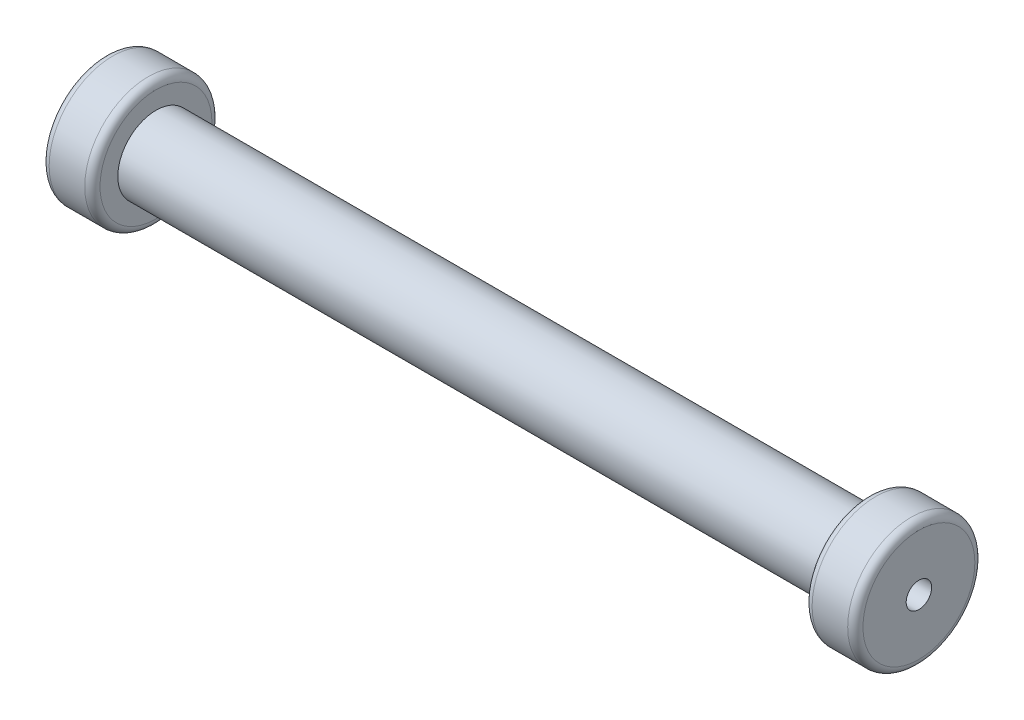
ISO-10303-21;
HEADER;
FILE_DESCRIPTION(('STEP AP214'),'2;1');
FILE_NAME('part.step','',(''),(''),'','','');
FILE_SCHEMA(('AUTOMOTIVE_DESIGN { 1 0 10303 214 1 1 1 1 }'));
ENDSEC;
DATA;
#1=APPLICATION_CONTEXT('core data for automotive mechanical design processes');
#2=APPLICATION_PROTOCOL_DEFINITION('international standard','automotive_design',2000,#1);
#3=PRODUCT_CONTEXT('',#1,'mechanical');
#4=PRODUCT('Part','Part','',(#3));
#5=PRODUCT_RELATED_PRODUCT_CATEGORY('part','',(#4));
#6=PRODUCT_DEFINITION_FORMATION('','',#4);
#7=PRODUCT_DEFINITION_CONTEXT('part definition',#1,'design');
#8=PRODUCT_DEFINITION('design','',#6,#7);
#9=PRODUCT_DEFINITION_SHAPE('','',#8);
#10=(LENGTH_UNIT() NAMED_UNIT(*) SI_UNIT(.MILLI.,.METRE.));
#11=(NAMED_UNIT(*) PLANE_ANGLE_UNIT() SI_UNIT($,.RADIAN.));
#12=(NAMED_UNIT(*) SI_UNIT($,.STERADIAN.) SOLID_ANGLE_UNIT());
#13=UNCERTAINTY_MEASURE_WITH_UNIT(LENGTH_MEASURE(1.E-05),#10,'distance_accuracy_value','');
#14=(GEOMETRIC_REPRESENTATION_CONTEXT(3) GLOBAL_UNCERTAINTY_ASSIGNED_CONTEXT((#13)) GLOBAL_UNIT_ASSIGNED_CONTEXT((#10,
#11,#12)) REPRESENTATION_CONTEXT('',''));
#15=CARTESIAN_POINT('',(0.,0.,0.));
#16=DIRECTION('',(0.,0.,1.));
#17=DIRECTION('',(1.,0.,0.));
#18=AXIS2_PLACEMENT_3D('',#15,#16,#17);
#19=CARTESIAN_POINT('',(-179.61578341398,0.,0.));
#20=DIRECTION('',(-1.,0.,0.));
#21=DIRECTION('',(0.,0.,1.));
#22=AXIS2_PLACEMENT_3D('',#19,#20,#21);
#23=CYLINDRICAL_SURFACE('',#22,24.9999999999999);
#24=CARTESIAN_POINT('',(143.,0.,0.));
#25=DIRECTION('',(-1.,0.,0.));
#26=DIRECTION('',(0.,0.,1.));
#27=AXIS2_PLACEMENT_3D('',#24,#25,#26);
#28=CIRCLE('',#27,24.9999999999999);
#29=CARTESIAN_POINT('',(143.,0.,24.9999999999999));
#30=VERTEX_POINT('',#29);
#31=EDGE_CURVE('E73',#30,#30,#28,.F.);
#32=ORIENTED_EDGE('',*,*,#31,.T.);
#33=EDGE_LOOP('',(#32));
#34=FACE_BOUND('',#33,.T.);
#35=CARTESIAN_POINT('',(157.,0.,0.));
#36=DIRECTION('',(1.,0.,0.));
#37=DIRECTION('',(0.,0.,-1.));
#38=AXIS2_PLACEMENT_3D('',#35,#36,#37);
#39=CIRCLE('',#38,24.9999999999999);
#40=CARTESIAN_POINT('',(157.,0.,-24.9999999999999));
#41=VERTEX_POINT('',#40);
#42=EDGE_CURVE('E77',#41,#41,#39,.F.);
#43=ORIENTED_EDGE('',*,*,#42,.T.);
#44=EDGE_LOOP('',(#43));
#45=FACE_BOUND('',#44,.T.);
#46=ADVANCED_FACE('F45',(#34,#45),#23,.T.);
#47=CARTESIAN_POINT('',(140.,0.,24.9999999999999));
#48=DIRECTION('',(-1.,0.,0.));
#49=DIRECTION('',(0.,0.,1.));
#50=AXIS2_PLACEMENT_3D('',#47,#48,#49);
#51=PLANE('',#50);
#52=CARTESIAN_POINT('',(140.,0.,0.));
#53=DIRECTION('',(-1.,0.,0.));
#54=DIRECTION('',(0.,0.,1.));
#55=AXIS2_PLACEMENT_3D('',#52,#53,#54);
#56=CIRCLE('',#55,21.9999999999999);
#57=CARTESIAN_POINT('',(140.,0.,21.9999999999999));
#58=VERTEX_POINT('',#57);
#59=EDGE_CURVE('E81',#58,#58,#56,.T.);
#60=ORIENTED_EDGE('',*,*,#59,.T.);
#61=EDGE_LOOP('',(#60));
#62=FACE_BOUND('',#61,.T.);
#63=CARTESIAN_POINT('',(140.,0.,0.));
#64=DIRECTION('',(-1.,0.,0.));
#65=DIRECTION('',(0.,0.,1.));
#66=AXIS2_PLACEMENT_3D('',#63,#64,#65);
#67=CIRCLE('',#66,15.);
#68=CARTESIAN_POINT('',(140.,0.,15.));
#69=VERTEX_POINT('',#68);
#70=EDGE_CURVE('E85',#69,#69,#67,.T.);
#71=ORIENTED_EDGE('',*,*,#70,.F.);
#72=EDGE_LOOP('',(#71));
#73=FACE_BOUND('',#72,.T.);
#74=ADVANCED_FACE('F126',(#62,#73),#51,.T.);
#75=CARTESIAN_POINT('',(-179.61578341398,0.,0.));
#76=DIRECTION('',(-1.,0.,0.));
#77=DIRECTION('',(0.,0.,1.));
#78=AXIS2_PLACEMENT_3D('',#75,#76,#77);
#79=CYLINDRICAL_SURFACE('',#78,15.);
#80=ORIENTED_EDGE('',*,*,#70,.T.);
#81=EDGE_LOOP('',(#80));
#82=FACE_BOUND('',#81,.T.);
#83=CARTESIAN_POINT('',(-140.,0.,0.));
#84=DIRECTION('',(-1.,0.,0.));
#85=DIRECTION('',(0.,0.,1.));
#86=AXIS2_PLACEMENT_3D('',#83,#84,#85);
#87=CIRCLE('',#86,15.);
#88=CARTESIAN_POINT('',(-140.,0.,15.));
#89=VERTEX_POINT('',#88);
#90=EDGE_CURVE('E89',#89,#89,#87,.T.);
#91=ORIENTED_EDGE('',*,*,#90,.F.);
#92=EDGE_LOOP('',(#91));
#93=FACE_BOUND('',#92,.T.);
#94=ADVANCED_FACE('F133',(#82,#93),#79,.T.);
#95=CARTESIAN_POINT('',(-140.,0.,24.9999999999999));
#96=DIRECTION('',(1.,0.,0.));
#97=DIRECTION('',(0.,0.,-1.));
#98=AXIS2_PLACEMENT_3D('',#95,#96,#97);
#99=PLANE('',#98);
#100=CARTESIAN_POINT('',(-140.,0.,0.));
#101=DIRECTION('',(1.,0.,0.));
#102=DIRECTION('',(0.,0.,-1.));
#103=AXIS2_PLACEMENT_3D('',#100,#101,#102);
#104=CIRCLE('',#103,21.9999999999999);
#105=CARTESIAN_POINT('',(-140.,0.,-21.9999999999999));
#106=VERTEX_POINT('',#105);
#107=EDGE_CURVE('E10',#106,#106,#104,.T.);
#108=ORIENTED_EDGE('',*,*,#107,.T.);
#109=EDGE_LOOP('',(#108));
#110=FACE_BOUND('',#109,.T.);
#111=ORIENTED_EDGE('',*,*,#90,.T.);
#112=EDGE_LOOP('',(#111));
#113=FACE_BOUND('',#112,.T.);
#114=ADVANCED_FACE('F154',(#110,#113),#99,.T.);
#115=CARTESIAN_POINT('',(-179.61578341398,0.,0.));
#116=DIRECTION('',(-1.,0.,0.));
#117=DIRECTION('',(0.,0.,1.));
#118=AXIS2_PLACEMENT_3D('',#115,#116,#117);
#119=CYLINDRICAL_SURFACE('',#118,24.9999999999999);
#120=CARTESIAN_POINT('',(-157.,0.,0.));
#121=DIRECTION('',(-1.,0.,0.));
#122=DIRECTION('',(0.,0.,1.));
#123=AXIS2_PLACEMENT_3D('',#120,#121,#122);
#124=CIRCLE('',#123,24.9999999999999);
#125=CARTESIAN_POINT('',(-157.,0.,24.9999999999999));
#126=VERTEX_POINT('',#125);
#127=EDGE_CURVE('E53',#126,#126,#124,.F.);
#128=ORIENTED_EDGE('',*,*,#127,.T.);
#129=EDGE_LOOP('',(#128));
#130=FACE_BOUND('',#129,.T.);
#131=CARTESIAN_POINT('',(-143.,0.,0.));
#132=DIRECTION('',(1.,0.,0.));
#133=DIRECTION('',(0.,0.,-1.));
#134=AXIS2_PLACEMENT_3D('',#131,#132,#133);
#135=CIRCLE('',#134,24.9999999999999);
#136=CARTESIAN_POINT('',(-143.,0.,-24.9999999999999));
#137=VERTEX_POINT('',#136);
#138=EDGE_CURVE('E58',#137,#137,#135,.F.);
#139=ORIENTED_EDGE('',*,*,#138,.T.);
#140=EDGE_LOOP('',(#139));
#141=FACE_BOUND('',#140,.T.);
#142=ADVANCED_FACE('F149',(#130,#141),#119,.T.);
#143=CARTESIAN_POINT('',(-160.,0.,0.));
#144=DIRECTION('',(-1.,0.,0.));
#145=DIRECTION('',(0.,0.,1.));
#146=AXIS2_PLACEMENT_3D('',#143,#144,#145);
#147=PLANE('',#146);
#148=CARTESIAN_POINT('',(-160.,0.,0.));
#149=DIRECTION('',(1.,0.,0.));
#150=DIRECTION('',(0.,0.,-1.));
#151=AXIS2_PLACEMENT_3D('',#148,#149,#150);
#152=CIRCLE('',#151,5.);
#153=CARTESIAN_POINT('',(-160.,0.,-5.));
#154=VERTEX_POINT('',#153);
#155=EDGE_CURVE('E93',#154,#154,#152,.T.);
#156=ORIENTED_EDGE('',*,*,#155,.T.);
#157=EDGE_LOOP('',(#156));
#158=FACE_BOUND('',#157,.T.);
#159=CARTESIAN_POINT('',(-160.,0.,0.));
#160=DIRECTION('',(-1.,0.,0.));
#161=DIRECTION('',(0.,0.,1.));
#162=AXIS2_PLACEMENT_3D('',#159,#160,#161);
#163=CIRCLE('',#162,21.9999999999999);
#164=CARTESIAN_POINT('',(-160.,0.,21.9999999999999));
#165=VERTEX_POINT('',#164);
#166=EDGE_CURVE('E63',#165,#165,#163,.T.);
#167=ORIENTED_EDGE('',*,*,#166,.T.);
#168=EDGE_LOOP('',(#167));
#169=FACE_BOUND('',#168,.T.);
#170=ADVANCED_FACE('F102',(#158,#169),#147,.T.);
#171=CARTESIAN_POINT('',(160.,0.,0.));
#172=DIRECTION('',(1.,0.,0.));
#173=DIRECTION('',(0.,0.,-1.));
#174=AXIS2_PLACEMENT_3D('',#171,#172,#173);
#175=PLANE('',#174);
#176=CARTESIAN_POINT('',(160.,0.,0.));
#177=DIRECTION('',(1.,0.,0.));
#178=DIRECTION('',(0.,0.,-1.));
#179=AXIS2_PLACEMENT_3D('',#176,#177,#178);
#180=CIRCLE('',#179,5.);
#181=CARTESIAN_POINT('',(160.,0.,-5.));
#182=VERTEX_POINT('',#181);
#183=EDGE_CURVE('E94',#182,#182,#180,.T.);
#184=ORIENTED_EDGE('',*,*,#183,.F.);
#185=EDGE_LOOP('',(#184));
#186=FACE_BOUND('',#185,.T.);
#187=CARTESIAN_POINT('',(160.,0.,0.));
#188=DIRECTION('',(1.,0.,0.));
#189=DIRECTION('',(0.,0.,-1.));
#190=AXIS2_PLACEMENT_3D('',#187,#188,#189);
#191=CIRCLE('',#190,21.9999999999999);
#192=CARTESIAN_POINT('',(160.,0.,-21.9999999999999));
#193=VERTEX_POINT('',#192);
#194=EDGE_CURVE('E69',#193,#193,#191,.T.);
#195=ORIENTED_EDGE('',*,*,#194,.T.);
#196=EDGE_LOOP('',(#195));
#197=FACE_BOUND('',#196,.T.);
#198=ADVANCED_FACE('F111',(#186,#197),#175,.T.);
#199=CARTESIAN_POINT('',(143.,0.,0.));
#200=DIRECTION('',(-1.,0.,0.));
#201=DIRECTION('',(0.,0.,1.));
#202=AXIS2_PLACEMENT_3D('',#199,#200,#201);
#203=TOROIDAL_SURFACE('',#202,21.9999999999999,3.);
#204=ORIENTED_EDGE('',*,*,#31,.F.);
#205=EDGE_LOOP('',(#204));
#206=FACE_BOUND('',#205,.T.);
#207=ORIENTED_EDGE('',*,*,#59,.F.);
#208=EDGE_LOOP('',(#207));
#209=FACE_BOUND('',#208,.T.);
#210=ADVANCED_FACE('F114',(#206,#209),#203,.T.);
#211=CARTESIAN_POINT('',(157.,0.,0.));
#212=DIRECTION('',(1.,0.,0.));
#213=DIRECTION('',(0.,0.,-1.));
#214=AXIS2_PLACEMENT_3D('',#211,#212,#213);
#215=TOROIDAL_SURFACE('',#214,21.9999999999999,3.);
#216=ORIENTED_EDGE('',*,*,#194,.F.);
#217=EDGE_LOOP('',(#216));
#218=FACE_BOUND('',#217,.T.);
#219=ORIENTED_EDGE('',*,*,#42,.F.);
#220=EDGE_LOOP('',(#219));
#221=FACE_BOUND('',#220,.T.);
#222=ADVANCED_FACE('F118',(#218,#221),#215,.T.);
#223=CARTESIAN_POINT('',(-157.,0.,0.));
#224=DIRECTION('',(-1.,0.,0.));
#225=DIRECTION('',(0.,0.,1.));
#226=AXIS2_PLACEMENT_3D('',#223,#224,#225);
#227=TOROIDAL_SURFACE('',#226,21.9999999999999,3.);
#228=ORIENTED_EDGE('',*,*,#127,.F.);
#229=EDGE_LOOP('',(#228));
#230=FACE_BOUND('',#229,.T.);
#231=ORIENTED_EDGE('',*,*,#166,.F.);
#232=EDGE_LOOP('',(#231));
#233=FACE_BOUND('',#232,.T.);
#234=ADVANCED_FACE('F121',(#230,#233),#227,.T.);
#235=CARTESIAN_POINT('',(-143.,0.,0.));
#236=DIRECTION('',(1.,0.,0.));
#237=DIRECTION('',(0.,0.,-1.));
#238=AXIS2_PLACEMENT_3D('',#235,#236,#237);
#239=TOROIDAL_SURFACE('',#238,21.9999999999999,3.);
#240=ORIENTED_EDGE('',*,*,#107,.F.);
#241=EDGE_LOOP('',(#240));
#242=FACE_BOUND('',#241,.T.);
#243=ORIENTED_EDGE('',*,*,#138,.F.);
#244=EDGE_LOOP('',(#243));
#245=FACE_BOUND('',#244,.T.);
#246=ADVANCED_FACE('F47',(#242,#245),#239,.T.);
#247=CARTESIAN_POINT('',(-160.,0.,0.));
#248=DIRECTION('',(1.,0.,0.));
#249=DIRECTION('',(0.,0.,-1.));
#250=AXIS2_PLACEMENT_3D('',#247,#248,#249);
#251=CYLINDRICAL_SURFACE('',#250,5.);
#252=ORIENTED_EDGE('',*,*,#155,.F.);
#253=EDGE_LOOP('',(#252));
#254=FACE_BOUND('',#253,.T.);
#255=ORIENTED_EDGE('',*,*,#183,.T.);
#256=EDGE_LOOP('',(#255));
#257=FACE_BOUND('',#256,.T.);
#258=ADVANCED_FACE('F105',(#254,#257),#251,.F.);
#259=CLOSED_SHELL('',(#46,#74,#94,#114,#142,#170,#198,#210,#222,#234,#246,#258));
#260=MANIFOLD_SOLID_BREP('B2',#259);
#261=ADVANCED_BREP_SHAPE_REPRESENTATION('',(#18,#260),#14);
#262=SHAPE_DEFINITION_REPRESENTATION(#9,#261);
ENDSEC;
END-ISO-10303-21;
